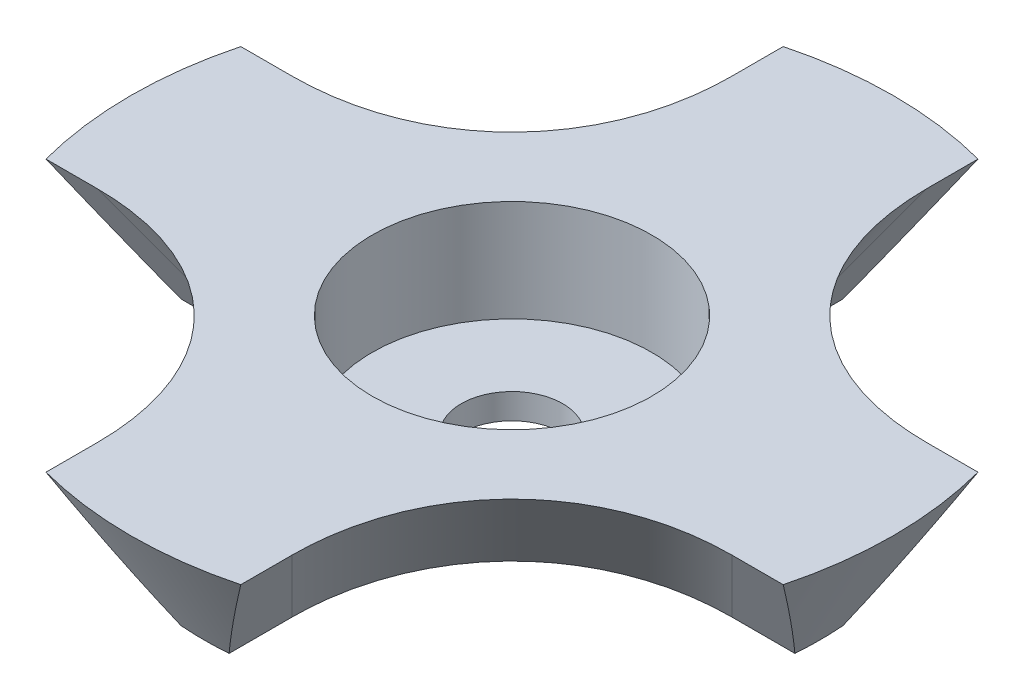
ISO-10303-21;
HEADER;
FILE_DESCRIPTION(('STEP AP214'),'2;1');
FILE_NAME('part.step','',(''),(''),'','','');
FILE_SCHEMA(('AUTOMOTIVE_DESIGN { 1 0 10303 214 1 1 1 1 }'));
ENDSEC;
DATA;
#1=APPLICATION_CONTEXT('core data for automotive mechanical design processes');
#2=APPLICATION_PROTOCOL_DEFINITION('international standard','automotive_design',2000,#1);
#3=PRODUCT_CONTEXT('',#1,'mechanical');
#4=PRODUCT('Part','Part','',(#3));
#5=PRODUCT_RELATED_PRODUCT_CATEGORY('part','',(#4));
#6=PRODUCT_DEFINITION_FORMATION('','',#4);
#7=PRODUCT_DEFINITION_CONTEXT('part definition',#1,'design');
#8=PRODUCT_DEFINITION('design','',#6,#7);
#9=PRODUCT_DEFINITION_SHAPE('','',#8);
#10=(LENGTH_UNIT() NAMED_UNIT(*) SI_UNIT(.MILLI.,.METRE.));
#11=(NAMED_UNIT(*) PLANE_ANGLE_UNIT() SI_UNIT($,.RADIAN.));
#12=(NAMED_UNIT(*) SI_UNIT($,.STERADIAN.) SOLID_ANGLE_UNIT());
#13=UNCERTAINTY_MEASURE_WITH_UNIT(LENGTH_MEASURE(1.E-05),#10,'distance_accuracy_value','');
#14=(GEOMETRIC_REPRESENTATION_CONTEXT(3) GLOBAL_UNCERTAINTY_ASSIGNED_CONTEXT((#13)) GLOBAL_UNIT_ASSIGNED_CONTEXT((#10,
#11,#12)) REPRESENTATION_CONTEXT('',''));
#15=CARTESIAN_POINT('',(0.,0.,0.));
#16=DIRECTION('',(0.,0.,1.));
#17=DIRECTION('',(1.,0.,0.));
#18=AXIS2_PLACEMENT_3D('',#15,#16,#17);
#19=CARTESIAN_POINT('',(0.,10.,0.));
#20=DIRECTION('',(0.,-1.,0.));
#21=DIRECTION('',(0.,0.,-1.));
#22=AXIS2_PLACEMENT_3D('',#19,#20,#21);
#23=CYLINDRICAL_SURFACE('',#22,4.);
#24=CARTESIAN_POINT('',(0.,0.,0.));
#25=DIRECTION('',(0.,1.,0.));
#26=DIRECTION('',(0.,0.,1.));
#27=AXIS2_PLACEMENT_3D('',#24,#25,#26);
#28=CIRCLE('',#27,4.);
#29=CARTESIAN_POINT('',(0.,0.,4.));
#30=VERTEX_POINT('',#29);
#31=EDGE_CURVE('E143',#30,#30,#28,.T.);
#32=ORIENTED_EDGE('',*,*,#31,.F.);
#33=EDGE_LOOP('',(#32));
#34=FACE_BOUND('',#33,.T.);
#35=CARTESIAN_POINT('',(0.,2.,0.));
#36=DIRECTION('',(0.,1.,0.));
#37=DIRECTION('',(0.,0.,1.));
#38=AXIS2_PLACEMENT_3D('',#35,#36,#37);
#39=CIRCLE('',#38,4.);
#40=CARTESIAN_POINT('',(0.,2.,4.));
#41=VERTEX_POINT('',#40);
#42=EDGE_CURVE('E38',#41,#41,#39,.T.);
#43=ORIENTED_EDGE('',*,*,#42,.T.);
#44=EDGE_LOOP('',(#43));
#45=FACE_BOUND('',#44,.T.);
#46=ADVANCED_FACE('F34',(#34,#45),#23,.F.);
#47=CARTESIAN_POINT('',(0.,0.,0.));
#48=DIRECTION('',(0.,1.,0.));
#49=DIRECTION('',(0.,0.,1.));
#50=AXIS2_PLACEMENT_3D('',#47,#48,#49);
#51=PLANE('',#50);
#52=ORIENTED_EDGE('',*,*,#31,.T.);
#53=EDGE_LOOP('',(#52));
#54=FACE_BOUND('',#53,.T.);
#55=DIRECTION('',(0.,0.,1.));
#56=VECTOR('',#55,1.);
#57=CARTESIAN_POINT('',(1.89149730810374,0.,0.));
#58=LINE('',#57,#56);
#59=CARTESIAN_POINT('',(1.89149730810374,0.,-19.2120053837925));
#60=VERTEX_POINT('',#59);
#61=CARTESIAN_POINT('',(1.89149730810374,0.,-24.1525445813271));
#62=VERTEX_POINT('',#61);
#63=EDGE_CURVE('E137',#60,#62,#58,.F.);
#64=ORIENTED_EDGE('',*,*,#63,.F.);
#65=CARTESIAN_POINT('',(24.9855080756888,0.,-24.9855080756888));
#66=DIRECTION('',(0.,1.,0.));
#67=DIRECTION('',(0.707106781186548,0.,-0.707106781186548));
#68=AXIS2_PLACEMENT_3D('',#65,#66,#67);
#69=ELLIPSE('',#68,25.8198889747161,20.);
#70=CARTESIAN_POINT('',(19.2120053837925,0.,-1.89149730810374));
#71=VERTEX_POINT('',#70);
#72=EDGE_CURVE('E160',#60,#71,#69,.T.);
#73=ORIENTED_EDGE('',*,*,#72,.T.);
#74=DIRECTION('',(1.,0.,0.));
#75=VECTOR('',#74,1.);
#76=CARTESIAN_POINT('',(0.,0.,-1.89149730810374));
#77=LINE('',#76,#75);
#78=CARTESIAN_POINT('',(24.1525445813271,0.,-1.89149730810374));
#79=VERTEX_POINT('',#78);
#80=EDGE_CURVE('E140',#71,#79,#77,.T.);
#81=ORIENTED_EDGE('',*,*,#80,.T.);
#82=CARTESIAN_POINT('',(0.,0.,0.));
#83=DIRECTION('',(0.,1.,0.));
#84=DIRECTION('',(0.,0.,1.));
#85=AXIS2_PLACEMENT_3D('',#82,#83,#84);
#86=CIRCLE('',#85,24.2264973081037);
#87=CARTESIAN_POINT('',(24.1525445813271,0.,1.89149730810374));
#88=VERTEX_POINT('',#87);
#89=EDGE_CURVE('E144',#88,#79,#86,.T.);
#90=ORIENTED_EDGE('',*,*,#89,.F.);
#91=DIRECTION('',(-1.,0.,0.));
#92=VECTOR('',#91,1.);
#93=CARTESIAN_POINT('',(0.,0.,1.89149730810374));
#94=LINE('',#93,#92);
#95=CARTESIAN_POINT('',(19.2120053837925,0.,1.89149730810374));
#96=VERTEX_POINT('',#95);
#97=EDGE_CURVE('E368',#96,#88,#94,.F.);
#98=ORIENTED_EDGE('',*,*,#97,.F.);
#99=CARTESIAN_POINT('',(24.9855080756888,0.,24.9855080756888));
#100=DIRECTION('',(0.,1.,0.));
#101=DIRECTION('',(0.707106781186548,0.,0.707106781186548));
#102=AXIS2_PLACEMENT_3D('',#99,#100,#101);
#103=ELLIPSE('',#102,25.8198889747161,20.);
#104=CARTESIAN_POINT('',(1.89149730810374,0.,19.2120053837925));
#105=VERTEX_POINT('',#104);
#106=EDGE_CURVE('E166',#96,#105,#103,.T.);
#107=ORIENTED_EDGE('',*,*,#106,.T.);
#108=DIRECTION('',(0.,0.,1.));
#109=VECTOR('',#108,1.);
#110=CARTESIAN_POINT('',(1.89149730810374,0.,0.));
#111=LINE('',#110,#109);
#112=CARTESIAN_POINT('',(1.89149730810374,0.,24.1525445813271));
#113=VERTEX_POINT('',#112);
#114=EDGE_CURVE('E370',#105,#113,#111,.T.);
#115=ORIENTED_EDGE('',*,*,#114,.T.);
#116=CARTESIAN_POINT('',(0.,0.,0.));
#117=DIRECTION('',(0.,1.,0.));
#118=DIRECTION('',(0.,0.,1.));
#119=AXIS2_PLACEMENT_3D('',#116,#117,#118);
#120=CIRCLE('',#119,24.2264973081037);
#121=CARTESIAN_POINT('',(-1.89149730810374,0.,24.1525445813271));
#122=VERTEX_POINT('',#121);
#123=EDGE_CURVE('E372',#122,#113,#120,.T.);
#124=ORIENTED_EDGE('',*,*,#123,.F.);
#125=DIRECTION('',(0.,0.,-1.));
#126=VECTOR('',#125,1.);
#127=CARTESIAN_POINT('',(-1.89149730810374,0.,0.));
#128=LINE('',#127,#126);
#129=CARTESIAN_POINT('',(-1.89149730810374,0.,19.2120053837925));
#130=VERTEX_POINT('',#129);
#131=EDGE_CURVE('E377',#130,#122,#128,.F.);
#132=ORIENTED_EDGE('',*,*,#131,.F.);
#133=CARTESIAN_POINT('',(-24.9855080756888,0.,24.9855080756888));
#134=DIRECTION('',(0.,1.,0.));
#135=DIRECTION('',(-0.707106781186548,0.,0.707106781186548));
#136=AXIS2_PLACEMENT_3D('',#133,#134,#135);
#137=ELLIPSE('',#136,25.8198889747161,20.);
#138=CARTESIAN_POINT('',(-19.2120053837925,0.,1.89149730810374));
#139=VERTEX_POINT('',#138);
#140=EDGE_CURVE('E76',#130,#139,#137,.T.);
#141=ORIENTED_EDGE('',*,*,#140,.T.);
#142=DIRECTION('',(-1.,0.,0.));
#143=VECTOR('',#142,1.);
#144=CARTESIAN_POINT('',(0.,0.,1.89149730810374));
#145=LINE('',#144,#143);
#146=CARTESIAN_POINT('',(-24.1525445813271,0.,1.89149730810374));
#147=VERTEX_POINT('',#146);
#148=EDGE_CURVE('E129',#139,#147,#145,.T.);
#149=ORIENTED_EDGE('',*,*,#148,.T.);
#150=CARTESIAN_POINT('',(0.,0.,0.));
#151=DIRECTION('',(0.,1.,0.));
#152=DIRECTION('',(0.,0.,1.));
#153=AXIS2_PLACEMENT_3D('',#150,#151,#152);
#154=CIRCLE('',#153,24.2264973081037);
#155=CARTESIAN_POINT('',(-24.1525445813271,0.,-1.89149730810374));
#156=VERTEX_POINT('',#155);
#157=EDGE_CURVE('E126',#156,#147,#154,.T.);
#158=ORIENTED_EDGE('',*,*,#157,.F.);
#159=DIRECTION('',(1.,0.,0.));
#160=VECTOR('',#159,1.);
#161=CARTESIAN_POINT('',(0.,0.,-1.89149730810374));
#162=LINE('',#161,#160);
#163=CARTESIAN_POINT('',(-19.2120053837925,0.,-1.89149730810374));
#164=VERTEX_POINT('',#163);
#165=EDGE_CURVE('E116',#164,#156,#162,.F.);
#166=ORIENTED_EDGE('',*,*,#165,.F.);
#167=CARTESIAN_POINT('',(-24.9855080756888,0.,-24.9855080756888));
#168=DIRECTION('',(0.,1.,0.));
#169=DIRECTION('',(-0.707106781186548,0.,-0.707106781186548));
#170=AXIS2_PLACEMENT_3D('',#167,#168,#169);
#171=ELLIPSE('',#170,25.8198889747161,20.);
#172=CARTESIAN_POINT('',(-1.89149730810374,0.,-19.2120053837925));
#173=VERTEX_POINT('',#172);
#174=EDGE_CURVE('E44',#164,#173,#171,.T.);
#175=ORIENTED_EDGE('',*,*,#174,.T.);
#176=DIRECTION('',(0.,0.,-1.));
#177=VECTOR('',#176,1.);
#178=CARTESIAN_POINT('',(-1.89149730810374,0.,0.));
#179=LINE('',#178,#177);
#180=CARTESIAN_POINT('',(-1.89149730810374,0.,-24.1525445813271));
#181=VERTEX_POINT('',#180);
#182=EDGE_CURVE('E127',#173,#181,#179,.T.);
#183=ORIENTED_EDGE('',*,*,#182,.T.);
#184=CARTESIAN_POINT('',(0.,0.,0.));
#185=DIRECTION('',(0.,1.,0.));
#186=DIRECTION('',(0.,0.,1.));
#187=AXIS2_PLACEMENT_3D('',#184,#185,#186);
#188=CIRCLE('',#187,24.2264973081037);
#189=EDGE_CURVE('E131',#62,#181,#188,.T.);
#190=ORIENTED_EDGE('',*,*,#189,.F.);
#191=EDGE_LOOP('',(#64,#73,#81,#90,#98,#107,#115,#124,#132,#141,#149,#158,#166,#175,#183,#190));
#192=FACE_BOUND('',#191,.T.);
#193=ADVANCED_FACE('F123',(#54,#192),#51,.F.);
#194=CARTESIAN_POINT('',(7.665,10.,0.));
#195=DIRECTION('',(0.866025403784438,-0.5,0.));
#196=DIRECTION('',(0.5,0.866025403784438,0.));
#197=AXIS2_PLACEMENT_3D('',#194,#195,#196);
#198=PLANE('',#197);
#199=DIRECTION('',(0.,0.,-1.));
#200=VECTOR('',#199,1.);
#201=CARTESIAN_POINT('',(7.665,10.,0.));
#202=LINE('',#201,#200);
#203=CARTESIAN_POINT('',(7.665,10.,-24.9855080756888));
#204=VERTEX_POINT('',#203);
#205=CARTESIAN_POINT('',(7.665,10.,-29.0042716681526));
#206=VERTEX_POINT('',#205);
#207=EDGE_CURVE('E327',#204,#206,#202,.T.);
#208=ORIENTED_EDGE('',*,*,#207,.F.);
#209=DIRECTION('',(-0.447213595499958,-0.774596669241483,0.447213595499958));
#210=VECTOR('',#209,1.);
#211=CARTESIAN_POINT('',(2.66789838486224,1.34476611199691,-19.988406460551));
#212=LINE('',#211,#210);
#213=EDGE_CURVE('E145',#204,#60,#212,.T.);
#214=ORIENTED_EDGE('',*,*,#213,.T.);
#215=ORIENTED_EDGE('',*,*,#63,.T.);
#216=CARTESIAN_POINT('',(7.665,10.,-29.0042716681526));
#217=CARTESIAN_POINT('',(7.17786512919236,9.15625765362268,-28.6290961157152));
#218=CARTESIAN_POINT('',(6.69192272022932,8.31458071174628,-28.2476633811042));
#219=CARTESIAN_POINT('',(5.72297849131065,6.63632007755848,-27.470880873191));
#220=CARTESIAN_POINT('',(5.23997592586803,5.79973509402576,-27.0755348165646));
#221=CARTESIAN_POINT('',(4.27717366021372,4.13211265227007,-26.2692966481716));
#222=CARTESIAN_POINT('',(3.79737419288013,3.30107559740381,-25.8584034202369));
#223=CARTESIAN_POINT('',(3.08047649692661,2.05937236418324,-25.2289738596981));
#224=CARTESIAN_POINT('',(2.84194542596855,1.64622443010008,-25.0169528082638));
#225=CARTESIAN_POINT('',(2.36592102168406,0.82172597623662,-24.5882857097804));
#226=CARTESIAN_POINT('',(2.1284277020535,0.410375480178289,-24.3716396019121));
#227=CARTESIAN_POINT('',(1.89149730810374,0.,-24.1525445813271));
#228=B_SPLINE_CURVE_WITH_KNOTS('',3,(#216,#217,#218,#219,#220,#221,#222,#223,#224,#225,#226,
#227),.UNSPECIFIED.,.F.,.F.,(4,2,2,2,2,4),(0.,3.13204275539629,6.26325510364059,
9.39469267711004,10.9608354011689,12.5269987325808),.UNSPECIFIED.);
#229=EDGE_CURVE('E149',#206,#62,#228,.T.);
#230=ORIENTED_EDGE('',*,*,#229,.F.);
#231=EDGE_LOOP('',(#208,#214,#215,#230));
#232=FACE_BOUND('',#231,.T.);
#233=ADVANCED_FACE('F211',(#232),#198,.T.);
#234=CARTESIAN_POINT('',(0.,10.,0.));
#235=DIRECTION('',(0.,1.,0.));
#236=DIRECTION('',(0.,0.,1.));
#237=AXIS2_PLACEMENT_3D('',#234,#235,#236);
#238=CONICAL_SURFACE('',#237,30.,0.523598775598299);
#239=ORIENTED_EDGE('',*,*,#189,.T.);
#240=CARTESIAN_POINT('',(-7.665,10.,-29.0042716681526));
#241=CARTESIAN_POINT('',(-7.17786512919236,9.15625765362268,-28.6290961157152));
#242=CARTESIAN_POINT('',(-6.69192272022932,8.31458071174628,-28.2476633811042));
#243=CARTESIAN_POINT('',(-5.72297849131065,6.63632007755848,-27.470880873191));
#244=CARTESIAN_POINT('',(-5.23997592586803,5.79973509402576,-27.0755348165646));
#245=CARTESIAN_POINT('',(-4.27717366021372,4.13211265227007,-26.2692966481716));
#246=CARTESIAN_POINT('',(-3.79737419288013,3.30107559740381,-25.8584034202369));
#247=CARTESIAN_POINT('',(-3.08047649692661,2.05937236418324,-25.2289738596981));
#248=CARTESIAN_POINT('',(-2.84194542596855,1.64622443010008,-25.0169528082638));
#249=CARTESIAN_POINT('',(-2.36592102168406,0.82172597623662,-24.5882857097804));
#250=CARTESIAN_POINT('',(-2.1284277020535,0.410375480178289,-24.3716396019121));
#251=CARTESIAN_POINT('',(-1.89149730810374,0.,-24.1525445813271));
#252=B_SPLINE_CURVE_WITH_KNOTS('',3,(#240,#241,#242,#243,#244,#245,#246,#247,#248,#249,#250,
#251),.UNSPECIFIED.,.F.,.F.,(4,2,2,2,2,4),(0.,3.13204275539629,6.26325510364059,
9.39469267711004,10.9608354011689,12.5269987325808),.UNSPECIFIED.);
#253=CARTESIAN_POINT('',(-7.665,10.,-29.0042716681526));
#254=VERTEX_POINT('',#253);
#255=EDGE_CURVE('E285',#254,#181,#252,.T.);
#256=ORIENTED_EDGE('',*,*,#255,.F.);
#257=CARTESIAN_POINT('',(0.,10.,0.));
#258=DIRECTION('',(0.,1.,0.));
#259=DIRECTION('',(0.,0.,1.));
#260=AXIS2_PLACEMENT_3D('',#257,#258,#259);
#261=CIRCLE('',#260,30.);
#262=EDGE_CURVE('E334',#206,#254,#261,.T.);
#263=ORIENTED_EDGE('',*,*,#262,.F.);
#264=ORIENTED_EDGE('',*,*,#229,.T.);
#265=EDGE_LOOP('',(#239,#256,#263,#264));
#266=FACE_BOUND('',#265,.T.);
#267=ADVANCED_FACE('F295',(#266),#238,.T.);
#268=CARTESIAN_POINT('',(-7.665,10.,0.));
#269=DIRECTION('',(-0.866025403784438,-0.5,0.));
#270=DIRECTION('',(0.5,-0.866025403784438,0.));
#271=AXIS2_PLACEMENT_3D('',#268,#269,#270);
#272=PLANE('',#271);
#273=ORIENTED_EDGE('',*,*,#182,.F.);
#274=DIRECTION('',(-0.447213595499958,0.774596669241483,-0.447213595499958));
#275=VECTOR('',#274,1.);
#276=CARTESIAN_POINT('',(-2.66789838486224,1.34476611199691,-19.988406460551));
#277=LINE('',#276,#275);
#278=CARTESIAN_POINT('',(-7.665,10.,-24.9855080756888));
#279=VERTEX_POINT('',#278);
#280=EDGE_CURVE('E52',#173,#279,#277,.T.);
#281=ORIENTED_EDGE('',*,*,#280,.T.);
#282=DIRECTION('',(0.,0.,-1.));
#283=VECTOR('',#282,1.);
#284=CARTESIAN_POINT('',(-7.665,10.,0.));
#285=LINE('',#284,#283);
#286=EDGE_CURVE('E336',#279,#254,#285,.T.);
#287=ORIENTED_EDGE('',*,*,#286,.T.);
#288=ORIENTED_EDGE('',*,*,#255,.T.);
#289=EDGE_LOOP('',(#273,#281,#287,#288));
#290=FACE_BOUND('',#289,.T.);
#291=ADVANCED_FACE('F294',(#290),#272,.T.);
#292=CARTESIAN_POINT('',(0.,10.,-7.665));
#293=DIRECTION('',(0.,-0.5,-0.866025403784438));
#294=DIRECTION('',(0.,0.866025403784438,-0.5));
#295=AXIS2_PLACEMENT_3D('',#292,#293,#294);
#296=PLANE('',#295);
#297=DIRECTION('',(-1.,0.,0.));
#298=VECTOR('',#297,1.);
#299=CARTESIAN_POINT('',(0.,10.,-7.665));
#300=LINE('',#299,#298);
#301=CARTESIAN_POINT('',(-24.9855080756888,10.,-7.665));
#302=VERTEX_POINT('',#301);
#303=CARTESIAN_POINT('',(-29.0042716681526,10.,-7.665));
#304=VERTEX_POINT('',#303);
#305=EDGE_CURVE('E118',#302,#304,#300,.T.);
#306=ORIENTED_EDGE('',*,*,#305,.F.);
#307=DIRECTION('',(0.447213595499958,-0.774596669241483,0.447213595499958));
#308=VECTOR('',#307,1.);
#309=CARTESIAN_POINT('',(-19.988406460551,1.34476611199691,-2.66789838486224));
#310=LINE('',#309,#308);
#311=EDGE_CURVE('E105',#302,#164,#310,.T.);
#312=ORIENTED_EDGE('',*,*,#311,.T.);
#313=ORIENTED_EDGE('',*,*,#165,.T.);
#314=CARTESIAN_POINT('',(-29.0042716681526,10.,-7.665));
#315=CARTESIAN_POINT('',(-28.6290961157152,9.15625765362268,-7.17786512919236));
#316=CARTESIAN_POINT('',(-28.2476633811042,8.31458071174628,-6.69192272022932));
#317=CARTESIAN_POINT('',(-27.470880873191,6.63632007755849,-5.72297849131065));
#318=CARTESIAN_POINT('',(-27.0755348165646,5.79973509402577,-5.23997592586803));
#319=CARTESIAN_POINT('',(-26.2692966481716,4.13211265227007,-4.27717366021372));
#320=CARTESIAN_POINT('',(-25.8584034202369,3.30107559740382,-3.79737419288014));
#321=CARTESIAN_POINT('',(-25.2289738596981,2.05937236418325,-3.08047649692661));
#322=CARTESIAN_POINT('',(-25.0169528082638,1.64622443010008,-2.84194542596856));
#323=CARTESIAN_POINT('',(-24.5882857097804,0.821725976236624,-2.36592102168406));
#324=CARTESIAN_POINT('',(-24.3716396019121,0.410375480178293,-2.1284277020535));
#325=CARTESIAN_POINT('',(-24.1525445813271,0.,-1.89149730810374));
#326=B_SPLINE_CURVE_WITH_KNOTS('',3,(#314,#315,#316,#317,#318,#319,#320,#321,#322,#323,#324,
#325),.UNSPECIFIED.,.F.,.F.,(4,2,2,2,2,4),(0.,3.13204275539629,6.26325510364059,
9.39469267711003,10.9608354011689,12.5269987325807),.UNSPECIFIED.);
#327=EDGE_CURVE('E280',#304,#156,#326,.T.);
#328=ORIENTED_EDGE('',*,*,#327,.F.);
#329=EDGE_LOOP('',(#306,#312,#313,#328));
#330=FACE_BOUND('',#329,.T.);
#331=ADVANCED_FACE('F113',(#330),#296,.T.);
#332=CARTESIAN_POINT('',(0.,10.,0.));
#333=DIRECTION('',(0.,1.,0.));
#334=DIRECTION('',(0.,0.,1.));
#335=AXIS2_PLACEMENT_3D('',#332,#333,#334);
#336=CONICAL_SURFACE('',#335,30.,0.523598775598299);
#337=ORIENTED_EDGE('',*,*,#157,.T.);
#338=CARTESIAN_POINT('',(-29.0042716681526,10.,7.665));
#339=CARTESIAN_POINT('',(-28.6290961157152,9.15625765362268,7.17786512919236));
#340=CARTESIAN_POINT('',(-28.2476633811042,8.31458071174628,6.69192272022932));
#341=CARTESIAN_POINT('',(-27.470880873191,6.63632007755849,5.72297849131065));
#342=CARTESIAN_POINT('',(-27.0755348165646,5.79973509402577,5.23997592586803));
#343=CARTESIAN_POINT('',(-26.2692966481716,4.13211265227007,4.27717366021372));
#344=CARTESIAN_POINT('',(-25.8584034202369,3.30107559740382,3.79737419288014));
#345=CARTESIAN_POINT('',(-25.2289738596981,2.05937236418325,3.08047649692661));
#346=CARTESIAN_POINT('',(-25.0169528082638,1.64622443010008,2.84194542596856));
#347=CARTESIAN_POINT('',(-24.5882857097804,0.821725976236624,2.36592102168406));
#348=CARTESIAN_POINT('',(-24.3716396019121,0.410375480178293,2.1284277020535));
#349=CARTESIAN_POINT('',(-24.1525445813271,0.,1.89149730810374));
#350=B_SPLINE_CURVE_WITH_KNOTS('',3,(#338,#339,#340,#341,#342,#343,#344,#345,#346,#347,#348,
#349),.UNSPECIFIED.,.F.,.F.,(4,2,2,2,2,4),(0.,3.13204275539629,6.26325510364059,
9.39469267711003,10.9608354011689,12.5269987325807),.UNSPECIFIED.);
#351=CARTESIAN_POINT('',(-29.0042716681526,10.,7.665));
#352=VERTEX_POINT('',#351);
#353=EDGE_CURVE('E263',#352,#147,#350,.T.);
#354=ORIENTED_EDGE('',*,*,#353,.F.);
#355=CARTESIAN_POINT('',(0.,10.,0.));
#356=DIRECTION('',(0.,1.,0.));
#357=DIRECTION('',(0.,0.,1.));
#358=AXIS2_PLACEMENT_3D('',#355,#356,#357);
#359=CIRCLE('',#358,30.);
#360=EDGE_CURVE('E345',#304,#352,#359,.T.);
#361=ORIENTED_EDGE('',*,*,#360,.F.);
#362=ORIENTED_EDGE('',*,*,#327,.T.);
#363=EDGE_LOOP('',(#337,#354,#361,#362));
#364=FACE_BOUND('',#363,.T.);
#365=ADVANCED_FACE('F273',(#364),#336,.T.);
#366=CARTESIAN_POINT('',(0.,10.,7.665));
#367=DIRECTION('',(0.,-0.5,0.866025403784438));
#368=DIRECTION('',(0.,-0.866025403784438,-0.5));
#369=AXIS2_PLACEMENT_3D('',#366,#367,#368);
#370=PLANE('',#369);
#371=ORIENTED_EDGE('',*,*,#148,.F.);
#372=DIRECTION('',(-0.447213595499958,0.774596669241483,0.447213595499958));
#373=VECTOR('',#372,1.);
#374=CARTESIAN_POINT('',(-19.988406460551,1.34476611199691,2.66789838486224));
#375=LINE('',#374,#373);
#376=CARTESIAN_POINT('',(-24.9855080756888,10.,7.665));
#377=VERTEX_POINT('',#376);
#378=EDGE_CURVE('E119',#139,#377,#375,.T.);
#379=ORIENTED_EDGE('',*,*,#378,.T.);
#380=DIRECTION('',(-1.,0.,0.));
#381=VECTOR('',#380,1.);
#382=CARTESIAN_POINT('',(0.,10.,7.665));
#383=LINE('',#382,#381);
#384=EDGE_CURVE('E184',#377,#352,#383,.T.);
#385=ORIENTED_EDGE('',*,*,#384,.T.);
#386=ORIENTED_EDGE('',*,*,#353,.T.);
#387=EDGE_LOOP('',(#371,#379,#385,#386));
#388=FACE_BOUND('',#387,.T.);
#389=ADVANCED_FACE('F272',(#388),#370,.T.);
#390=CARTESIAN_POINT('',(-7.665,10.,0.));
#391=DIRECTION('',(-0.866025403784438,-0.5,0.));
#392=DIRECTION('',(0.5,-0.866025403784438,0.));
#393=AXIS2_PLACEMENT_3D('',#390,#391,#392);
#394=PLANE('',#393);
#395=DIRECTION('',(0.,0.,1.));
#396=VECTOR('',#395,1.);
#397=CARTESIAN_POINT('',(-7.665,10.,0.));
#398=LINE('',#397,#396);
#399=CARTESIAN_POINT('',(-7.665,10.,24.9855080756888));
#400=VERTEX_POINT('',#399);
#401=CARTESIAN_POINT('',(-7.665,10.,29.0042716681526));
#402=VERTEX_POINT('',#401);
#403=EDGE_CURVE('E180',#400,#402,#398,.T.);
#404=ORIENTED_EDGE('',*,*,#403,.F.);
#405=DIRECTION('',(0.447213595499958,-0.774596669241483,-0.447213595499958));
#406=VECTOR('',#405,1.);
#407=CARTESIAN_POINT('',(-2.66789838486224,1.34476611199691,19.988406460551));
#408=LINE('',#407,#406);
#409=EDGE_CURVE('E156',#400,#130,#408,.T.);
#410=ORIENTED_EDGE('',*,*,#409,.T.);
#411=ORIENTED_EDGE('',*,*,#131,.T.);
#412=CARTESIAN_POINT('',(-7.665,10.,29.0042716681526));
#413=CARTESIAN_POINT('',(-7.17786512919236,9.15625765362268,28.6290961157152));
#414=CARTESIAN_POINT('',(-6.69192272022932,8.31458071174628,28.2476633811042));
#415=CARTESIAN_POINT('',(-5.72297849131065,6.63632007755848,27.470880873191));
#416=CARTESIAN_POINT('',(-5.23997592586803,5.79973509402576,27.0755348165646));
#417=CARTESIAN_POINT('',(-4.27717366021372,4.13211265227007,26.2692966481716));
#418=CARTESIAN_POINT('',(-3.79737419288013,3.30107559740381,25.8584034202369));
#419=CARTESIAN_POINT('',(-3.08047649692661,2.05937236418324,25.2289738596981));
#420=CARTESIAN_POINT('',(-2.84194542596855,1.64622443010008,25.0169528082638));
#421=CARTESIAN_POINT('',(-2.36592102168406,0.82172597623662,24.5882857097804));
#422=CARTESIAN_POINT('',(-2.1284277020535,0.410375480178289,24.3716396019121));
#423=CARTESIAN_POINT('',(-1.89149730810374,0.,24.1525445813271));
#424=B_SPLINE_CURVE_WITH_KNOTS('',3,(#412,#413,#414,#415,#416,#417,#418,#419,#420,#421,#422,
#423),.UNSPECIFIED.,.F.,.F.,(4,2,2,2,2,4),(0.,3.13204275539629,6.26325510364059,
9.39469267711004,10.9608354011689,12.5269987325808),.UNSPECIFIED.);
#425=EDGE_CURVE('E190',#402,#122,#424,.T.);
#426=ORIENTED_EDGE('',*,*,#425,.F.);
#427=EDGE_LOOP('',(#404,#410,#411,#426));
#428=FACE_BOUND('',#427,.T.);
#429=ADVANCED_FACE('F186',(#428),#394,.T.);
#430=CARTESIAN_POINT('',(0.,10.,0.));
#431=DIRECTION('',(0.,1.,0.));
#432=DIRECTION('',(0.,0.,1.));
#433=AXIS2_PLACEMENT_3D('',#430,#431,#432);
#434=CONICAL_SURFACE('',#433,30.,0.523598775598299);
#435=ORIENTED_EDGE('',*,*,#123,.T.);
#436=CARTESIAN_POINT('',(7.665,10.,29.0042716681526));
#437=CARTESIAN_POINT('',(7.17786512919236,9.15625765362268,28.6290961157152));
#438=CARTESIAN_POINT('',(6.69192272022932,8.31458071174628,28.2476633811042));
#439=CARTESIAN_POINT('',(5.72297849131065,6.63632007755848,27.470880873191));
#440=CARTESIAN_POINT('',(5.23997592586803,5.79973509402576,27.0755348165646));
#441=CARTESIAN_POINT('',(4.27717366021372,4.13211265227007,26.2692966481716));
#442=CARTESIAN_POINT('',(3.79737419288013,3.30107559740381,25.8584034202369));
#443=CARTESIAN_POINT('',(3.08047649692661,2.05937236418324,25.2289738596981));
#444=CARTESIAN_POINT('',(2.84194542596855,1.64622443010008,25.0169528082638));
#445=CARTESIAN_POINT('',(2.36592102168406,0.82172597623662,24.5882857097804));
#446=CARTESIAN_POINT('',(2.1284277020535,0.410375480178289,24.3716396019121));
#447=CARTESIAN_POINT('',(1.89149730810374,0.,24.1525445813271));
#448=B_SPLINE_CURVE_WITH_KNOTS('',3,(#436,#437,#438,#439,#440,#441,#442,#443,#444,#445,#446,
#447),.UNSPECIFIED.,.F.,.F.,(4,2,2,2,2,4),(0.,3.13204275539629,6.26325510364059,
9.39469267711004,10.9608354011689,12.5269987325808),.UNSPECIFIED.);
#449=CARTESIAN_POINT('',(7.665,10.,29.0042716681526));
#450=VERTEX_POINT('',#449);
#451=EDGE_CURVE('E241',#450,#113,#448,.T.);
#452=ORIENTED_EDGE('',*,*,#451,.F.);
#453=CARTESIAN_POINT('',(0.,10.,0.));
#454=DIRECTION('',(0.,1.,0.));
#455=DIRECTION('',(0.,0.,1.));
#456=AXIS2_PLACEMENT_3D('',#453,#454,#455);
#457=CIRCLE('',#456,30.);
#458=EDGE_CURVE('E192',#402,#450,#457,.T.);
#459=ORIENTED_EDGE('',*,*,#458,.F.);
#460=ORIENTED_EDGE('',*,*,#425,.T.);
#461=EDGE_LOOP('',(#435,#452,#459,#460));
#462=FACE_BOUND('',#461,.T.);
#463=ADVANCED_FACE('F252',(#462),#434,.T.);
#464=CARTESIAN_POINT('',(7.665,10.,0.));
#465=DIRECTION('',(0.866025403784438,-0.5,0.));
#466=DIRECTION('',(0.5,0.866025403784438,0.));
#467=AXIS2_PLACEMENT_3D('',#464,#465,#466);
#468=PLANE('',#467);
#469=ORIENTED_EDGE('',*,*,#114,.F.);
#470=DIRECTION('',(0.447213595499958,0.774596669241483,0.447213595499958));
#471=VECTOR('',#470,1.);
#472=CARTESIAN_POINT('',(2.66789838486224,1.34476611199691,19.988406460551));
#473=LINE('',#472,#471);
#474=CARTESIAN_POINT('',(7.665,10.,24.9855080756888));
#475=VERTEX_POINT('',#474);
#476=EDGE_CURVE('E88',#105,#475,#473,.T.);
#477=ORIENTED_EDGE('',*,*,#476,.T.);
#478=DIRECTION('',(0.,0.,1.));
#479=VECTOR('',#478,1.);
#480=CARTESIAN_POINT('',(7.665,10.,0.));
#481=LINE('',#480,#479);
#482=EDGE_CURVE('E349',#475,#450,#481,.T.);
#483=ORIENTED_EDGE('',*,*,#482,.T.);
#484=ORIENTED_EDGE('',*,*,#451,.T.);
#485=EDGE_LOOP('',(#469,#477,#483,#484));
#486=FACE_BOUND('',#485,.T.);
#487=ADVANCED_FACE('F250',(#486),#468,.T.);
#488=CARTESIAN_POINT('',(0.,10.,7.665));
#489=DIRECTION('',(0.,-0.5,0.866025403784438));
#490=DIRECTION('',(0.,-0.866025403784438,-0.5));
#491=AXIS2_PLACEMENT_3D('',#488,#489,#490);
#492=PLANE('',#491);
#493=DIRECTION('',(1.,0.,0.));
#494=VECTOR('',#493,1.);
#495=CARTESIAN_POINT('',(0.,10.,7.665));
#496=LINE('',#495,#494);
#497=CARTESIAN_POINT('',(24.9855080756888,10.,7.665));
#498=VERTEX_POINT('',#497);
#499=CARTESIAN_POINT('',(29.0042716681526,10.,7.665));
#500=VERTEX_POINT('',#499);
#501=EDGE_CURVE('E351',#498,#500,#496,.T.);
#502=ORIENTED_EDGE('',*,*,#501,.F.);
#503=DIRECTION('',(-0.447213595499958,-0.774596669241483,-0.447213595499958));
#504=VECTOR('',#503,1.);
#505=CARTESIAN_POINT('',(19.988406460551,1.34476611199691,2.66789838486224));
#506=LINE('',#505,#504);
#507=EDGE_CURVE('E152',#498,#96,#506,.T.);
#508=ORIENTED_EDGE('',*,*,#507,.T.);
#509=ORIENTED_EDGE('',*,*,#97,.T.);
#510=CARTESIAN_POINT('',(29.0042716681526,10.,7.665));
#511=CARTESIAN_POINT('',(28.6290961157152,9.15625765362268,7.17786512919236));
#512=CARTESIAN_POINT('',(28.2476633811042,8.31458071174628,6.69192272022932));
#513=CARTESIAN_POINT('',(27.470880873191,6.63632007755849,5.72297849131065));
#514=CARTESIAN_POINT('',(27.0755348165646,5.79973509402577,5.23997592586803));
#515=CARTESIAN_POINT('',(26.2692966481716,4.13211265227007,4.27717366021372));
#516=CARTESIAN_POINT('',(25.8584034202369,3.30107559740382,3.79737419288014));
#517=CARTESIAN_POINT('',(25.2289738596981,2.05937236418325,3.08047649692661));
#518=CARTESIAN_POINT('',(25.0169528082638,1.64622443010008,2.84194542596856));
#519=CARTESIAN_POINT('',(24.5882857097804,0.821725976236624,2.36592102168406));
#520=CARTESIAN_POINT('',(24.3716396019121,0.410375480178293,2.1284277020535));
#521=CARTESIAN_POINT('',(24.1525445813271,0.,1.89149730810374));
#522=B_SPLINE_CURVE_WITH_KNOTS('',3,(#510,#511,#512,#513,#514,#515,#516,#517,#518,#519,#520,
#521),.UNSPECIFIED.,.F.,.F.,(4,2,2,2,2,4),(0.,3.13204275539629,6.26325510364059,
9.39469267711003,10.9608354011689,12.5269987325807),.UNSPECIFIED.);
#523=EDGE_CURVE('E235',#500,#88,#522,.T.);
#524=ORIENTED_EDGE('',*,*,#523,.F.);
#525=EDGE_LOOP('',(#502,#508,#509,#524));
#526=FACE_BOUND('',#525,.T.);
#527=ADVANCED_FACE('F223',(#526),#492,.T.);
#528=CARTESIAN_POINT('',(0.,10.,0.));
#529=DIRECTION('',(0.,1.,0.));
#530=DIRECTION('',(0.,0.,1.));
#531=AXIS2_PLACEMENT_3D('',#528,#529,#530);
#532=CONICAL_SURFACE('',#531,30.,0.523598775598299);
#533=ORIENTED_EDGE('',*,*,#89,.T.);
#534=CARTESIAN_POINT('',(29.0042716681526,10.,-7.665));
#535=CARTESIAN_POINT('',(28.6290961157152,9.15625765362268,-7.17786512919236));
#536=CARTESIAN_POINT('',(28.2476633811042,8.31458071174628,-6.69192272022932));
#537=CARTESIAN_POINT('',(27.470880873191,6.63632007755849,-5.72297849131065));
#538=CARTESIAN_POINT('',(27.0755348165646,5.79973509402577,-5.23997592586803));
#539=CARTESIAN_POINT('',(26.2692966481716,4.13211265227007,-4.27717366021372));
#540=CARTESIAN_POINT('',(25.8584034202369,3.30107559740382,-3.79737419288014));
#541=CARTESIAN_POINT('',(25.2289738596981,2.05937236418325,-3.08047649692661));
#542=CARTESIAN_POINT('',(25.0169528082638,1.64622443010008,-2.84194542596856));
#543=CARTESIAN_POINT('',(24.5882857097804,0.821725976236624,-2.36592102168406));
#544=CARTESIAN_POINT('',(24.3716396019121,0.410375480178293,-2.1284277020535));
#545=CARTESIAN_POINT('',(24.1525445813271,0.,-1.89149730810374));
#546=B_SPLINE_CURVE_WITH_KNOTS('',3,(#534,#535,#536,#537,#538,#539,#540,#541,#542,#543,#544,
#545),.UNSPECIFIED.,.F.,.F.,(4,2,2,2,2,4),(0.,3.13204275539629,6.26325510364059,
9.39469267711003,10.9608354011689,12.5269987325807),.UNSPECIFIED.);
#547=CARTESIAN_POINT('',(29.0042716681526,10.,-7.665));
#548=VERTEX_POINT('',#547);
#549=EDGE_CURVE('E229',#548,#79,#546,.T.);
#550=ORIENTED_EDGE('',*,*,#549,.F.);
#551=CARTESIAN_POINT('',(0.,10.,0.));
#552=DIRECTION('',(0.,1.,0.));
#553=DIRECTION('',(0.,0.,1.));
#554=AXIS2_PLACEMENT_3D('',#551,#552,#553);
#555=CIRCLE('',#554,30.);
#556=EDGE_CURVE('E354',#500,#548,#555,.T.);
#557=ORIENTED_EDGE('',*,*,#556,.F.);
#558=ORIENTED_EDGE('',*,*,#523,.T.);
#559=EDGE_LOOP('',(#533,#550,#557,#558));
#560=FACE_BOUND('',#559,.T.);
#561=ADVANCED_FACE('F218',(#560),#532,.T.);
#562=CARTESIAN_POINT('',(0.,10.,-7.665));
#563=DIRECTION('',(0.,-0.5,-0.866025403784438));
#564=DIRECTION('',(0.,0.866025403784438,-0.5));
#565=AXIS2_PLACEMENT_3D('',#562,#563,#564);
#566=PLANE('',#565);
#567=ORIENTED_EDGE('',*,*,#80,.F.);
#568=DIRECTION('',(0.447213595499958,0.774596669241483,-0.447213595499958));
#569=VECTOR('',#568,1.);
#570=CARTESIAN_POINT('',(19.988406460551,1.34476611199691,-2.66789838486224));
#571=LINE('',#570,#569);
#572=CARTESIAN_POINT('',(24.9855080756888,10.,-7.665));
#573=VERTEX_POINT('',#572);
#574=EDGE_CURVE('E148',#71,#573,#571,.T.);
#575=ORIENTED_EDGE('',*,*,#574,.T.);
#576=DIRECTION('',(1.,0.,0.));
#577=VECTOR('',#576,1.);
#578=CARTESIAN_POINT('',(0.,10.,-7.665));
#579=LINE('',#578,#577);
#580=EDGE_CURVE('E331',#573,#548,#579,.T.);
#581=ORIENTED_EDGE('',*,*,#580,.T.);
#582=ORIENTED_EDGE('',*,*,#549,.T.);
#583=EDGE_LOOP('',(#567,#575,#581,#582));
#584=FACE_BOUND('',#583,.T.);
#585=ADVANCED_FACE('F222',(#584),#566,.T.);
#586=CARTESIAN_POINT('',(0.,10.,0.));
#587=DIRECTION('',(0.,1.,0.));
#588=DIRECTION('',(0.,0.,1.));
#589=AXIS2_PLACEMENT_3D('',#586,#587,#588);
#590=PLANE('',#589);
#591=CARTESIAN_POINT('',(0.,10.,0.));
#592=DIRECTION('',(0.,1.,0.));
#593=DIRECTION('',(0.,0.,1.));
#594=AXIS2_PLACEMENT_3D('',#591,#592,#593);
#595=CIRCLE('',#594,11.);
#596=CARTESIAN_POINT('',(0.,10.,11.));
#597=VERTEX_POINT('',#596);
#598=EDGE_CURVE('E340',#597,#597,#595,.T.);
#599=ORIENTED_EDGE('',*,*,#598,.F.);
#600=EDGE_LOOP('',(#599));
#601=FACE_BOUND('',#600,.T.);
#602=ORIENTED_EDGE('',*,*,#580,.F.);
#603=CARTESIAN_POINT('',(30.759010767585,10.,-30.759010767585));
#604=DIRECTION('',(0.,1.,0.));
#605=DIRECTION('',(0.707106781186548,0.,-0.707106781186548));
#606=AXIS2_PLACEMENT_3D('',#603,#604,#605);
#607=ELLIPSE('',#606,25.8198889747161,20.);
#608=EDGE_CURVE('E163',#573,#204,#607,.F.);
#609=ORIENTED_EDGE('',*,*,#608,.T.);
#610=ORIENTED_EDGE('',*,*,#207,.T.);
#611=ORIENTED_EDGE('',*,*,#262,.T.);
#612=ORIENTED_EDGE('',*,*,#286,.F.);
#613=CARTESIAN_POINT('',(-30.759010767585,10.,-30.759010767585));
#614=DIRECTION('',(0.,1.,0.));
#615=DIRECTION('',(-0.707106781186548,0.,-0.707106781186548));
#616=AXIS2_PLACEMENT_3D('',#613,#614,#615);
#617=ELLIPSE('',#616,25.8198889747161,20.);
#618=EDGE_CURVE('E11',#279,#302,#617,.F.);
#619=ORIENTED_EDGE('',*,*,#618,.T.);
#620=ORIENTED_EDGE('',*,*,#305,.T.);
#621=ORIENTED_EDGE('',*,*,#360,.T.);
#622=ORIENTED_EDGE('',*,*,#384,.F.);
#623=CARTESIAN_POINT('',(-30.759010767585,10.,30.759010767585));
#624=DIRECTION('',(0.,1.,0.));
#625=DIRECTION('',(-0.707106781186548,0.,0.707106781186548));
#626=AXIS2_PLACEMENT_3D('',#623,#624,#625);
#627=ELLIPSE('',#626,25.8198889747161,20.);
#628=EDGE_CURVE('E109',#377,#400,#627,.F.);
#629=ORIENTED_EDGE('',*,*,#628,.T.);
#630=ORIENTED_EDGE('',*,*,#403,.T.);
#631=ORIENTED_EDGE('',*,*,#458,.T.);
#632=ORIENTED_EDGE('',*,*,#482,.F.);
#633=CARTESIAN_POINT('',(30.759010767585,10.,30.759010767585));
#634=DIRECTION('',(0.,1.,0.));
#635=DIRECTION('',(0.707106781186548,0.,0.707106781186548));
#636=AXIS2_PLACEMENT_3D('',#633,#634,#635);
#637=ELLIPSE('',#636,25.8198889747161,20.);
#638=EDGE_CURVE('E168',#475,#498,#637,.F.);
#639=ORIENTED_EDGE('',*,*,#638,.T.);
#640=ORIENTED_EDGE('',*,*,#501,.T.);
#641=ORIENTED_EDGE('',*,*,#556,.T.);
#642=EDGE_LOOP('',(#602,#609,#610,#611,#612,#619,#620,#621,#622,#629,#630,#631,#632,#639,#640,#641));
#643=FACE_BOUND('',#642,.T.);
#644=ADVANCED_FACE('F177',(#601,#643),#590,.T.);
#645=CARTESIAN_POINT('',(19.988406460551,-8.6552338880031,-19.988406460551));
#646=DIRECTION('',(0.447213595499958,0.774596669241483,-0.447213595499958));
#647=DIRECTION('',(0.,0.5,0.866025403784438));
#648=AXIS2_PLACEMENT_3D('',#645,#646,#647);
#649=CYLINDRICAL_SURFACE('',#648,20.);
#650=ORIENTED_EDGE('',*,*,#608,.F.);
#651=ORIENTED_EDGE('',*,*,#574,.F.);
#652=ORIENTED_EDGE('',*,*,#72,.F.);
#653=ORIENTED_EDGE('',*,*,#213,.F.);
#654=EDGE_LOOP('',(#650,#651,#652,#653));
#655=FACE_BOUND('',#654,.T.);
#656=ADVANCED_FACE('F202',(#655),#649,.F.);
#657=CARTESIAN_POINT('',(19.988406460551,-8.6552338880031,19.988406460551));
#658=DIRECTION('',(0.447213595499958,0.774596669241483,0.447213595499958));
#659=DIRECTION('',(0.,-0.5,0.866025403784438));
#660=AXIS2_PLACEMENT_3D('',#657,#658,#659);
#661=CYLINDRICAL_SURFACE('',#660,20.);
#662=ORIENTED_EDGE('',*,*,#638,.F.);
#663=ORIENTED_EDGE('',*,*,#476,.F.);
#664=ORIENTED_EDGE('',*,*,#106,.F.);
#665=ORIENTED_EDGE('',*,*,#507,.F.);
#666=EDGE_LOOP('',(#662,#663,#664,#665));
#667=FACE_BOUND('',#666,.T.);
#668=ADVANCED_FACE('F196',(#667),#661,.F.);
#669=CARTESIAN_POINT('',(-19.988406460551,-8.6552338880031,19.988406460551));
#670=DIRECTION('',(-0.447213595499958,0.774596669241483,0.447213595499958));
#671=DIRECTION('',(0.,-0.5,0.866025403784438));
#672=AXIS2_PLACEMENT_3D('',#669,#670,#671);
#673=CYLINDRICAL_SURFACE('',#672,20.);
#674=ORIENTED_EDGE('',*,*,#628,.F.);
#675=ORIENTED_EDGE('',*,*,#378,.F.);
#676=ORIENTED_EDGE('',*,*,#140,.F.);
#677=ORIENTED_EDGE('',*,*,#409,.F.);
#678=EDGE_LOOP('',(#674,#675,#676,#677));
#679=FACE_BOUND('',#678,.T.);
#680=ADVANCED_FACE('F194',(#679),#673,.F.);
#681=CARTESIAN_POINT('',(-19.988406460551,-8.6552338880031,-19.988406460551));
#682=DIRECTION('',(-0.447213595499958,0.774596669241483,-0.447213595499958));
#683=DIRECTION('',(0.,0.5,0.866025403784438));
#684=AXIS2_PLACEMENT_3D('',#681,#682,#683);
#685=CYLINDRICAL_SURFACE('',#684,20.);
#686=ORIENTED_EDGE('',*,*,#618,.F.);
#687=ORIENTED_EDGE('',*,*,#280,.F.);
#688=ORIENTED_EDGE('',*,*,#174,.F.);
#689=ORIENTED_EDGE('',*,*,#311,.F.);
#690=EDGE_LOOP('',(#686,#687,#688,#689));
#691=FACE_BOUND('',#690,.T.);
#692=ADVANCED_FACE('F36',(#691),#685,.F.);
#693=CARTESIAN_POINT('',(0.,2.,0.));
#694=DIRECTION('',(0.,1.,0.));
#695=DIRECTION('',(0.,0.,1.));
#696=AXIS2_PLACEMENT_3D('',#693,#694,#695);
#697=CYLINDRICAL_SURFACE('',#696,11.);
#698=CARTESIAN_POINT('',(0.,2.,0.));
#699=DIRECTION('',(0.,1.,0.));
#700=DIRECTION('',(0.,0.,1.));
#701=AXIS2_PLACEMENT_3D('',#698,#699,#700);
#702=CIRCLE('',#701,11.);
#703=CARTESIAN_POINT('',(0.,2.,11.));
#704=VERTEX_POINT('',#703);
#705=EDGE_CURVE('E472',#704,#704,#702,.T.);
#706=ORIENTED_EDGE('',*,*,#705,.F.);
#707=EDGE_LOOP('',(#706));
#708=FACE_BOUND('',#707,.T.);
#709=ORIENTED_EDGE('',*,*,#598,.T.);
#710=EDGE_LOOP('',(#709));
#711=FACE_BOUND('',#710,.T.);
#712=ADVANCED_FACE('F201',(#708,#711),#697,.F.);
#713=CARTESIAN_POINT('',(0.,2.,0.));
#714=DIRECTION('',(0.,1.,0.));
#715=DIRECTION('',(0.,0.,1.));
#716=AXIS2_PLACEMENT_3D('',#713,#714,#715);
#717=PLANE('',#716);
#718=ORIENTED_EDGE('',*,*,#42,.F.);
#719=EDGE_LOOP('',(#718));
#720=FACE_BOUND('',#719,.T.);
#721=ORIENTED_EDGE('',*,*,#705,.T.);
#722=EDGE_LOOP('',(#721));
#723=FACE_BOUND('',#722,.T.);
#724=ADVANCED_FACE('F453',(#720,#723),#717,.T.);
#725=CLOSED_SHELL('',(#46,#193,#233,#267,#291,#331,#365,#389,#429,#463,#487,#527,#561,#585,#644,
#656,#668,#680,#692,#712,#724));
#726=MANIFOLD_SOLID_BREP('B2',#725);
#727=ADVANCED_BREP_SHAPE_REPRESENTATION('',(#18,#726),#14);
#728=SHAPE_DEFINITION_REPRESENTATION(#9,#727);
ENDSEC;
END-ISO-10303-21;
